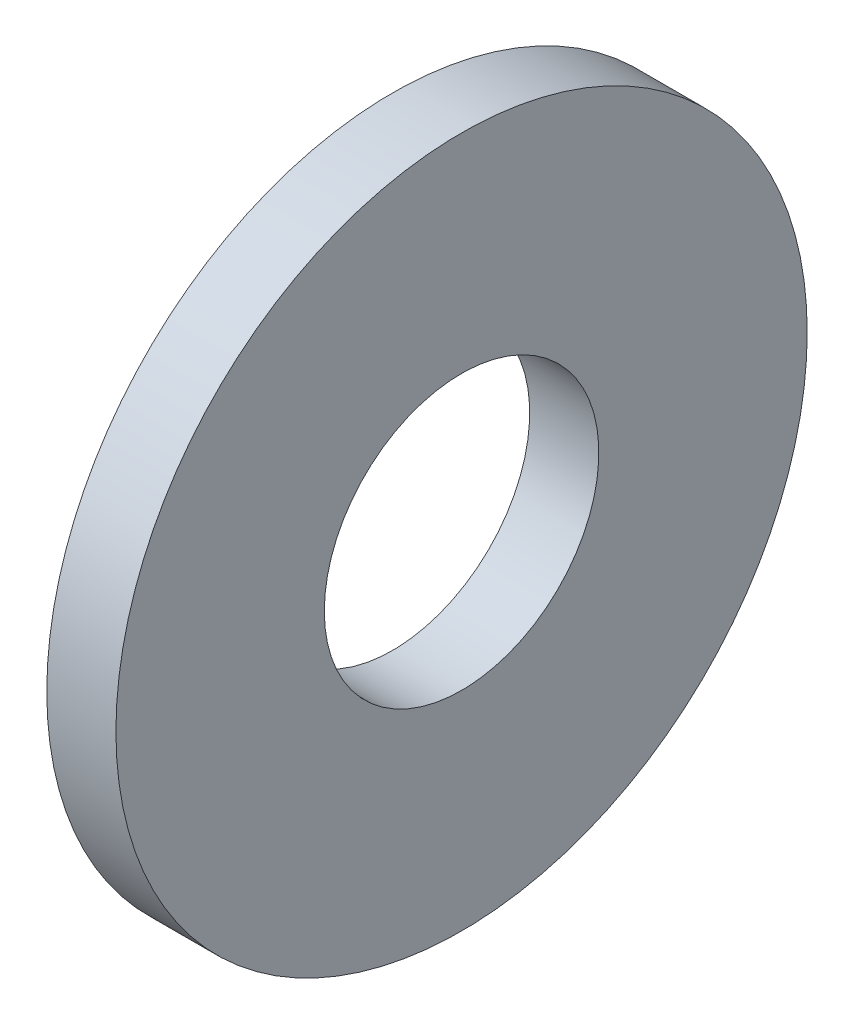
ISO-10303-21;
HEADER;
FILE_DESCRIPTION(('STEP AP214'),'2;1');
FILE_NAME('part.step','',(''),(''),'','','');
FILE_SCHEMA(('AUTOMOTIVE_DESIGN { 1 0 10303 214 1 1 1 1 }'));
ENDSEC;
DATA;
#1=APPLICATION_CONTEXT('core data for automotive mechanical design processes');
#2=APPLICATION_PROTOCOL_DEFINITION('international standard','automotive_design',2000,#1);
#3=PRODUCT_CONTEXT('',#1,'mechanical');
#4=PRODUCT('Part','Part','',(#3));
#5=PRODUCT_RELATED_PRODUCT_CATEGORY('part','',(#4));
#6=PRODUCT_DEFINITION_FORMATION('','',#4);
#7=PRODUCT_DEFINITION_CONTEXT('part definition',#1,'design');
#8=PRODUCT_DEFINITION('design','',#6,#7);
#9=PRODUCT_DEFINITION_SHAPE('','',#8);
#10=(LENGTH_UNIT() NAMED_UNIT(*) SI_UNIT(.MILLI.,.METRE.));
#11=(NAMED_UNIT(*) PLANE_ANGLE_UNIT() SI_UNIT($,.RADIAN.));
#12=(NAMED_UNIT(*) SI_UNIT($,.STERADIAN.) SOLID_ANGLE_UNIT());
#13=UNCERTAINTY_MEASURE_WITH_UNIT(LENGTH_MEASURE(1.E-05),#10,'distance_accuracy_value','');
#14=(GEOMETRIC_REPRESENTATION_CONTEXT(3) GLOBAL_UNCERTAINTY_ASSIGNED_CONTEXT((#13)) GLOBAL_UNIT_ASSIGNED_CONTEXT((#10,
#11,#12)) REPRESENTATION_CONTEXT('',''));
#15=CARTESIAN_POINT('',(0.,0.,0.));
#16=DIRECTION('',(0.,0.,1.));
#17=DIRECTION('',(1.,0.,0.));
#18=AXIS2_PLACEMENT_3D('',#15,#16,#17);
#19=CARTESIAN_POINT('',(-34.9249999999999,0.,0.));
#20=DIRECTION('',(-1.,0.,0.));
#21=DIRECTION('',(0.,0.,1.));
#22=AXIS2_PLACEMENT_3D('',#19,#20,#21);
#23=CYLINDRICAL_SURFACE('',#22,5.56);
#24=CARTESIAN_POINT('',(0.,0.,0.));
#25=DIRECTION('',(-1.,0.,0.));
#26=DIRECTION('',(0.,0.,1.));
#27=AXIS2_PLACEMENT_3D('',#24,#25,#26);
#28=CIRCLE('',#27,5.56);
#29=CARTESIAN_POINT('',(0.,0.,5.56));
#30=VERTEX_POINT('',#29);
#31=EDGE_CURVE('E10',#30,#30,#28,.T.);
#32=ORIENTED_EDGE('',*,*,#31,.F.);
#33=EDGE_LOOP('',(#32));
#34=FACE_BOUND('',#33,.T.);
#35=CARTESIAN_POINT('',(-2.8,0.,0.));
#36=DIRECTION('',(-1.,0.,0.));
#37=DIRECTION('',(0.,0.,1.));
#38=AXIS2_PLACEMENT_3D('',#35,#36,#37);
#39=CIRCLE('',#38,5.56);
#40=CARTESIAN_POINT('',(-2.8,0.,5.56));
#41=VERTEX_POINT('',#40);
#42=EDGE_CURVE('E51',#41,#41,#39,.T.);
#43=ORIENTED_EDGE('',*,*,#42,.T.);
#44=EDGE_LOOP('',(#43));
#45=FACE_BOUND('',#44,.T.);
#46=ADVANCED_FACE('F37',(#34,#45),#23,.F.);
#47=CARTESIAN_POINT('',(0.,5.56,0.));
#48=DIRECTION('',(-1.,0.,0.));
#49=DIRECTION('',(0.,0.,1.));
#50=AXIS2_PLACEMENT_3D('',#47,#48,#49);
#51=PLANE('',#50);
#52=CARTESIAN_POINT('',(0.,0.,0.));
#53=DIRECTION('',(-1.,0.,0.));
#54=DIRECTION('',(0.,0.,1.));
#55=AXIS2_PLACEMENT_3D('',#52,#53,#54);
#56=CIRCLE('',#55,14.);
#57=CARTESIAN_POINT('',(0.,0.,14.));
#58=VERTEX_POINT('',#57);
#59=EDGE_CURVE('E43',#58,#58,#56,.T.);
#60=ORIENTED_EDGE('',*,*,#59,.F.);
#61=EDGE_LOOP('',(#60));
#62=FACE_BOUND('',#61,.T.);
#63=ORIENTED_EDGE('',*,*,#31,.T.);
#64=EDGE_LOOP('',(#63));
#65=FACE_BOUND('',#64,.T.);
#66=ADVANCED_FACE('F66',(#62,#65),#51,.F.);
#67=CARTESIAN_POINT('',(-34.9249999999999,0.,0.));
#68=DIRECTION('',(-1.,0.,0.));
#69=DIRECTION('',(0.,0.,1.));
#70=AXIS2_PLACEMENT_3D('',#67,#68,#69);
#71=CYLINDRICAL_SURFACE('',#70,14.);
#72=CARTESIAN_POINT('',(-2.8,0.,0.));
#73=DIRECTION('',(-1.,0.,0.));
#74=DIRECTION('',(0.,0.,1.));
#75=AXIS2_PLACEMENT_3D('',#72,#73,#74);
#76=CIRCLE('',#75,14.);
#77=CARTESIAN_POINT('',(-2.8,0.,14.));
#78=VERTEX_POINT('',#77);
#79=EDGE_CURVE('E47',#78,#78,#76,.T.);
#80=ORIENTED_EDGE('',*,*,#79,.F.);
#81=EDGE_LOOP('',(#80));
#82=FACE_BOUND('',#81,.T.);
#83=ORIENTED_EDGE('',*,*,#59,.T.);
#84=EDGE_LOOP('',(#83));
#85=FACE_BOUND('',#84,.T.);
#86=ADVANCED_FACE('F61',(#82,#85),#71,.T.);
#87=CARTESIAN_POINT('',(-2.8,14.,0.));
#88=DIRECTION('',(1.,0.,0.));
#89=DIRECTION('',(0.,0.,-1.));
#90=AXIS2_PLACEMENT_3D('',#87,#88,#89);
#91=PLANE('',#90);
#92=ORIENTED_EDGE('',*,*,#42,.F.);
#93=EDGE_LOOP('',(#92));
#94=FACE_BOUND('',#93,.T.);
#95=ORIENTED_EDGE('',*,*,#79,.T.);
#96=EDGE_LOOP('',(#95));
#97=FACE_BOUND('',#96,.T.);
#98=ADVANCED_FACE('F58',(#94,#97),#91,.F.);
#99=CLOSED_SHELL('',(#46,#66,#86,#98));
#100=MANIFOLD_SOLID_BREP('B2',#99);
#101=ADVANCED_BREP_SHAPE_REPRESENTATION('',(#18,#100),#14);
#102=SHAPE_DEFINITION_REPRESENTATION(#9,#101);
ENDSEC;
END-ISO-10303-21;
